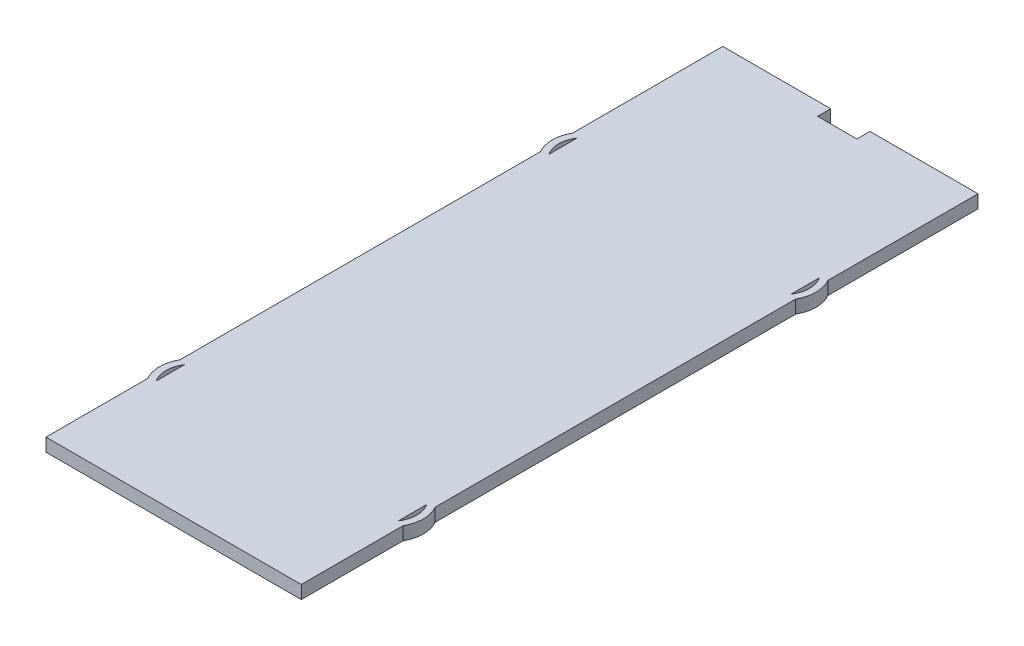
ISO-10303-21;
HEADER;
FILE_DESCRIPTION(('STEP AP214'),'2;1');
FILE_NAME('part.step','',(''),(''),'','','');
FILE_SCHEMA(('AUTOMOTIVE_DESIGN { 1 0 10303 214 1 1 1 1 }'));
ENDSEC;
DATA;
#1=APPLICATION_CONTEXT('core data for automotive mechanical design processes');
#2=APPLICATION_PROTOCOL_DEFINITION('international standard','automotive_design',2000,#1);
#3=PRODUCT_CONTEXT('',#1,'mechanical');
#4=PRODUCT('Part','Part','',(#3));
#5=PRODUCT_RELATED_PRODUCT_CATEGORY('part','',(#4));
#6=PRODUCT_DEFINITION_FORMATION('','',#4);
#7=PRODUCT_DEFINITION_CONTEXT('part definition',#1,'design');
#8=PRODUCT_DEFINITION('design','',#6,#7);
#9=PRODUCT_DEFINITION_SHAPE('','',#8);
#10=(LENGTH_UNIT() NAMED_UNIT(*) SI_UNIT(.MILLI.,.METRE.));
#11=(NAMED_UNIT(*) PLANE_ANGLE_UNIT() SI_UNIT($,.RADIAN.));
#12=(NAMED_UNIT(*) SI_UNIT($,.STERADIAN.) SOLID_ANGLE_UNIT());
#13=UNCERTAINTY_MEASURE_WITH_UNIT(LENGTH_MEASURE(1.E-05),#10,'distance_accuracy_value','');
#14=(GEOMETRIC_REPRESENTATION_CONTEXT(3) GLOBAL_UNCERTAINTY_ASSIGNED_CONTEXT((#13)) GLOBAL_UNIT_ASSIGNED_CONTEXT((#10,
#11,#12)) REPRESENTATION_CONTEXT('',''));
#15=CARTESIAN_POINT('',(0.,0.,0.));
#16=DIRECTION('',(0.,0.,1.));
#17=DIRECTION('',(1.,0.,0.));
#18=AXIS2_PLACEMENT_3D('',#15,#16,#17);
#19=CARTESIAN_POINT('',(-19.5,-110.51045199437,-85.4));
#20=DIRECTION('',(0.,0.,-1.));
#21=DIRECTION('',(-1.,0.,0.));
#22=AXIS2_PLACEMENT_3D('',#19,#20,#21);
#23=PLANE('',#22);
#24=DIRECTION('',(0.,1.,0.));
#25=VECTOR('',#24,1.);
#26=CARTESIAN_POINT('',(-3.,0.,-85.4));
#27=LINE('',#26,#25);
#28=CARTESIAN_POINT('',(-3.,0.,-85.4));
#29=VERTEX_POINT('',#28);
#30=CARTESIAN_POINT('',(-3.,2.,-85.4));
#31=VERTEX_POINT('',#30);
#32=EDGE_CURVE('E278',#29,#31,#27,.T.);
#33=ORIENTED_EDGE('',*,*,#32,.F.);
#34=DIRECTION('',(1.,0.,0.));
#35=VECTOR('',#34,1.);
#36=CARTESIAN_POINT('',(-19.5,0.,-85.4));
#37=LINE('',#36,#35);
#38=CARTESIAN_POINT('',(-19.5,0.,-85.4));
#39=VERTEX_POINT('',#38);
#40=EDGE_CURVE('E314',#39,#29,#37,.T.);
#41=ORIENTED_EDGE('',*,*,#40,.F.);
#42=DIRECTION('',(0.,1.,0.));
#43=VECTOR('',#42,1.);
#44=CARTESIAN_POINT('',(-19.5,-110.51045199437,-85.4));
#45=LINE('',#44,#43);
#46=CARTESIAN_POINT('',(-19.5,2.,-85.4));
#47=VERTEX_POINT('',#46);
#48=EDGE_CURVE('E340',#39,#47,#45,.T.);
#49=ORIENTED_EDGE('',*,*,#48,.T.);
#50=DIRECTION('',(-1.,0.,0.));
#51=VECTOR('',#50,1.);
#52=CARTESIAN_POINT('',(-19.5,2.,-85.4));
#53=LINE('',#52,#51);
#54=EDGE_CURVE('E334',#31,#47,#53,.T.);
#55=ORIENTED_EDGE('',*,*,#54,.F.);
#56=EDGE_LOOP('',(#33,#41,#49,#55));
#57=FACE_BOUND('',#56,.T.);
#58=ADVANCED_FACE('F32',(#57),#23,.T.);
#59=CARTESIAN_POINT('',(-19.5,-110.51045199437,-85.4));
#60=DIRECTION('',(-1.,0.,0.));
#61=DIRECTION('',(0.,0.,1.));
#62=AXIS2_PLACEMENT_3D('',#59,#60,#61);
#63=PLANE('',#62);
#64=DIRECTION('',(0.,0.,-1.));
#65=VECTOR('',#64,1.);
#66=CARTESIAN_POINT('',(-19.5,0.,-85.4));
#67=LINE('',#66,#65);
#68=CARTESIAN_POINT('',(-19.5,0.,-2.45203996704781));
#69=VERTEX_POINT('',#68);
#70=CARTESIAN_POINT('',(-19.5,0.,-57.5479600329522));
#71=VERTEX_POINT('',#70);
#72=EDGE_CURVE('E322',#69,#71,#67,.T.);
#73=ORIENTED_EDGE('',*,*,#72,.F.);
#74=DIRECTION('',(0.,-1.,0.));
#75=VECTOR('',#74,1.);
#76=CARTESIAN_POINT('',(-19.5,2.,-2.45203996704781));
#77=LINE('',#76,#75);
#78=CARTESIAN_POINT('',(-19.5,2.,-2.45203996704781));
#79=VERTEX_POINT('',#78);
#80=EDGE_CURVE('E11',#69,#79,#77,.F.);
#81=ORIENTED_EDGE('',*,*,#80,.T.);
#82=DIRECTION('',(0.,0.,1.));
#83=VECTOR('',#82,1.);
#84=CARTESIAN_POINT('',(-19.5,2.,-85.4));
#85=LINE('',#84,#83);
#86=CARTESIAN_POINT('',(-19.5,2.,-57.5479600329522));
#87=VERTEX_POINT('',#86);
#88=EDGE_CURVE('E327',#87,#79,#85,.T.);
#89=ORIENTED_EDGE('',*,*,#88,.F.);
#90=DIRECTION('',(0.,-1.,0.));
#91=VECTOR('',#90,1.);
#92=CARTESIAN_POINT('',(-19.5,2.,-57.5479600329522));
#93=LINE('',#92,#91);
#94=EDGE_CURVE('E351',#71,#87,#93,.F.);
#95=ORIENTED_EDGE('',*,*,#94,.F.);
#96=EDGE_LOOP('',(#73,#81,#89,#95));
#97=FACE_BOUND('',#96,.T.);
#98=ADVANCED_FACE('F391',(#97),#63,.T.);
#99=CARTESIAN_POINT('',(-19.5,2.,2.45203996704781));
#100=VERTEX_POINT('',#99);
#101=CARTESIAN_POINT('',(-19.5,2.,18.));
#102=VERTEX_POINT('',#101);
#103=EDGE_CURVE('E306',#100,#102,#85,.T.);
#104=ORIENTED_EDGE('',*,*,#103,.F.);
#105=DIRECTION('',(0.,-1.,0.));
#106=VECTOR('',#105,1.);
#107=CARTESIAN_POINT('',(-19.5,2.,2.45203996704781));
#108=LINE('',#107,#106);
#109=CARTESIAN_POINT('',(-19.5,0.,2.45203996704781));
#110=VERTEX_POINT('',#109);
#111=EDGE_CURVE('E40',#100,#110,#108,.T.);
#112=ORIENTED_EDGE('',*,*,#111,.T.);
#113=CARTESIAN_POINT('',(-19.5,0.,18.));
#114=VERTEX_POINT('',#113);
#115=EDGE_CURVE('E318',#114,#110,#67,.T.);
#116=ORIENTED_EDGE('',*,*,#115,.F.);
#117=DIRECTION('',(0.,1.,0.));
#118=VECTOR('',#117,1.);
#119=CARTESIAN_POINT('',(-19.5,-110.51045199437,18.));
#120=LINE('',#119,#118);
#121=EDGE_CURVE('E339',#114,#102,#120,.T.);
#122=ORIENTED_EDGE('',*,*,#121,.T.);
#123=EDGE_LOOP('',(#104,#112,#116,#122));
#124=FACE_BOUND('',#123,.T.);
#125=ADVANCED_FACE('F371',(#124),#63,.T.);
#126=CARTESIAN_POINT('',(19.5,-110.51045199437,-85.4));
#127=DIRECTION('',(1.,0.,0.));
#128=DIRECTION('',(0.,0.,-1.));
#129=AXIS2_PLACEMENT_3D('',#126,#127,#128);
#130=PLANE('',#129);
#131=DIRECTION('',(0.,0.,1.));
#132=VECTOR('',#131,1.);
#133=CARTESIAN_POINT('',(19.5,0.,-85.4));
#134=LINE('',#133,#132);
#135=CARTESIAN_POINT('',(19.5,0.,2.45203996704778));
#136=VERTEX_POINT('',#135);
#137=CARTESIAN_POINT('',(19.5,0.,18.));
#138=VERTEX_POINT('',#137);
#139=EDGE_CURVE('E313',#136,#138,#134,.T.);
#140=ORIENTED_EDGE('',*,*,#139,.F.);
#141=DIRECTION('',(0.,-1.,0.));
#142=VECTOR('',#141,1.);
#143=CARTESIAN_POINT('',(19.5,2.,2.45203996704779));
#144=LINE('',#143,#142);
#145=CARTESIAN_POINT('',(19.5,2.,2.45203996704778));
#146=VERTEX_POINT('',#145);
#147=EDGE_CURVE('E299',#136,#146,#144,.F.);
#148=ORIENTED_EDGE('',*,*,#147,.T.);
#149=DIRECTION('',(0.,0.,-1.));
#150=VECTOR('',#149,1.);
#151=CARTESIAN_POINT('',(19.5,2.,-85.4));
#152=LINE('',#151,#150);
#153=CARTESIAN_POINT('',(19.5,2.,18.));
#154=VERTEX_POINT('',#153);
#155=EDGE_CURVE('E331',#154,#146,#152,.T.);
#156=ORIENTED_EDGE('',*,*,#155,.F.);
#157=DIRECTION('',(0.,1.,0.));
#158=VECTOR('',#157,1.);
#159=CARTESIAN_POINT('',(19.5,-110.51045199437,18.));
#160=LINE('',#159,#158);
#161=EDGE_CURVE('E346',#138,#154,#160,.T.);
#162=ORIENTED_EDGE('',*,*,#161,.F.);
#163=EDGE_LOOP('',(#140,#148,#156,#162));
#164=FACE_BOUND('',#163,.T.);
#165=ADVANCED_FACE('F458',(#164),#130,.T.);
#166=CARTESIAN_POINT('',(19.5,2.,-2.4520399670478));
#167=VERTEX_POINT('',#166);
#168=CARTESIAN_POINT('',(19.5,2.,-57.5479600329522));
#169=VERTEX_POINT('',#168);
#170=EDGE_CURVE('E335',#167,#169,#152,.T.);
#171=ORIENTED_EDGE('',*,*,#170,.F.);
#172=DIRECTION('',(0.,-1.,0.));
#173=VECTOR('',#172,1.);
#174=CARTESIAN_POINT('',(19.5,2.,-2.4520399670478));
#175=LINE('',#174,#173);
#176=CARTESIAN_POINT('',(19.5,0.,-2.4520399670478));
#177=VERTEX_POINT('',#176);
#178=EDGE_CURVE('E295',#167,#177,#175,.T.);
#179=ORIENTED_EDGE('',*,*,#178,.T.);
#180=CARTESIAN_POINT('',(19.5,0.,-57.5479600329522));
#181=VERTEX_POINT('',#180);
#182=EDGE_CURVE('E312',#181,#177,#134,.T.);
#183=ORIENTED_EDGE('',*,*,#182,.F.);
#184=DIRECTION('',(0.,-1.,0.));
#185=VECTOR('',#184,1.);
#186=CARTESIAN_POINT('',(19.5,2.,-57.5479600329522));
#187=LINE('',#186,#185);
#188=EDGE_CURVE('E365',#181,#169,#187,.F.);
#189=ORIENTED_EDGE('',*,*,#188,.T.);
#190=EDGE_LOOP('',(#171,#179,#183,#189));
#191=FACE_BOUND('',#190,.T.);
#192=ADVANCED_FACE('F457',(#191),#130,.T.);
#193=CARTESIAN_POINT('',(19.5,2.,-62.4520399670478));
#194=VERTEX_POINT('',#193);
#195=CARTESIAN_POINT('',(19.5,2.,-85.4));
#196=VERTEX_POINT('',#195);
#197=EDGE_CURVE('E330',#194,#196,#152,.T.);
#198=ORIENTED_EDGE('',*,*,#197,.F.);
#199=DIRECTION('',(0.,-1.,0.));
#200=VECTOR('',#199,1.);
#201=CARTESIAN_POINT('',(19.5,2.,-62.4520399670478));
#202=LINE('',#201,#200);
#203=CARTESIAN_POINT('',(19.5,0.,-62.4520399670478));
#204=VERTEX_POINT('',#203);
#205=EDGE_CURVE('E360',#194,#204,#202,.T.);
#206=ORIENTED_EDGE('',*,*,#205,.T.);
#207=CARTESIAN_POINT('',(19.5,0.,-85.4));
#208=VERTEX_POINT('',#207);
#209=EDGE_CURVE('E308',#208,#204,#134,.T.);
#210=ORIENTED_EDGE('',*,*,#209,.F.);
#211=DIRECTION('',(0.,1.,0.));
#212=VECTOR('',#211,1.);
#213=CARTESIAN_POINT('',(19.5,-110.51045199437,-85.4));
#214=LINE('',#213,#212);
#215=EDGE_CURVE('E343',#208,#196,#214,.T.);
#216=ORIENTED_EDGE('',*,*,#215,.T.);
#217=EDGE_LOOP('',(#198,#206,#210,#216));
#218=FACE_BOUND('',#217,.T.);
#219=ADVANCED_FACE('F438',(#218),#130,.T.);
#220=CARTESIAN_POINT('',(-15.2,2.,-60.));
#221=DIRECTION('',(0.,-1.,0.));
#222=DIRECTION('',(0.,0.,-1.));
#223=AXIS2_PLACEMENT_3D('',#220,#221,#222);
#224=CYLINDRICAL_SURFACE('',#223,4.95);
#225=CARTESIAN_POINT('',(-15.2,2.,-60.));
#226=DIRECTION('',(0.,1.,0.));
#227=DIRECTION('',(0.,0.,1.));
#228=AXIS2_PLACEMENT_3D('',#225,#226,#227);
#229=CIRCLE('',#228,4.95);
#230=CARTESIAN_POINT('',(-19.5,2.,-62.4520399670478));
#231=VERTEX_POINT('',#230);
#232=EDGE_CURVE('E357',#231,#87,#229,.T.);
#233=ORIENTED_EDGE('',*,*,#232,.F.);
#234=DIRECTION('',(0.,-1.,0.));
#235=VECTOR('',#234,1.);
#236=CARTESIAN_POINT('',(-19.5,2.,-62.4520399670478));
#237=LINE('',#236,#235);
#238=CARTESIAN_POINT('',(-19.5,0.,-62.4520399670478));
#239=VERTEX_POINT('',#238);
#240=EDGE_CURVE('E353',#231,#239,#237,.T.);
#241=ORIENTED_EDGE('',*,*,#240,.T.);
#242=CARTESIAN_POINT('',(-15.2,0.,-60.));
#243=DIRECTION('',(0.,1.,0.));
#244=DIRECTION('',(0.,0.,1.));
#245=AXIS2_PLACEMENT_3D('',#242,#243,#244);
#246=CIRCLE('',#245,4.95);
#247=EDGE_CURVE('E356',#239,#71,#246,.T.);
#248=ORIENTED_EDGE('',*,*,#247,.T.);
#249=ORIENTED_EDGE('',*,*,#94,.T.);
#250=EDGE_LOOP('',(#233,#241,#248,#249));
#251=FACE_BOUND('',#250,.T.);
#252=ADVANCED_FACE('F34',(#251),#224,.T.);
#253=CARTESIAN_POINT('',(-15.2,2.,-60.));
#254=DIRECTION('',(0.,1.,0.));
#255=DIRECTION('',(0.,0.,1.));
#256=AXIS2_PLACEMENT_3D('',#253,#254,#255);
#257=PLANE('',#256);
#258=CARTESIAN_POINT('',(15.2,2.,0.));
#259=DIRECTION('',(0.,-1.,0.));
#260=DIRECTION('',(0.,0.,-1.));
#261=AXIS2_PLACEMENT_3D('',#258,#259,#260);
#262=CIRCLE('',#261,3.95);
#263=CARTESIAN_POINT('',(18.5,2.,-2.1708293346092));
#264=VERTEX_POINT('',#263);
#265=CARTESIAN_POINT('',(18.5,2.,2.17082933460919));
#266=VERTEX_POINT('',#265);
#267=EDGE_CURVE('E47',#264,#266,#262,.T.);
#268=ORIENTED_EDGE('',*,*,#267,.T.);
#269=DIRECTION('',(0.,0.,-1.));
#270=VECTOR('',#269,1.);
#271=CARTESIAN_POINT('',(18.5,2.,-2.1708293346092));
#272=LINE('',#271,#270);
#273=EDGE_CURVE('E200',#266,#264,#272,.T.);
#274=ORIENTED_EDGE('',*,*,#273,.T.);
#275=EDGE_LOOP('',(#268,#274));
#276=FACE_BOUND('',#275,.T.);
#277=CARTESIAN_POINT('',(-15.2,2.,0.));
#278=DIRECTION('',(0.,-1.,0.));
#279=DIRECTION('',(0.,0.,-1.));
#280=AXIS2_PLACEMENT_3D('',#277,#278,#279);
#281=CIRCLE('',#280,3.95);
#282=CARTESIAN_POINT('',(-18.5,2.,2.17082933460921));
#283=VERTEX_POINT('',#282);
#284=CARTESIAN_POINT('',(-18.5,2.,-2.17082933460921));
#285=VERTEX_POINT('',#284);
#286=EDGE_CURVE('E55',#283,#285,#281,.T.);
#287=ORIENTED_EDGE('',*,*,#286,.T.);
#288=DIRECTION('',(0.,0.,1.));
#289=VECTOR('',#288,1.);
#290=CARTESIAN_POINT('',(-18.5,2.,-2.17082933460921));
#291=LINE('',#290,#289);
#292=EDGE_CURVE('E217',#285,#283,#291,.T.);
#293=ORIENTED_EDGE('',*,*,#292,.T.);
#294=EDGE_LOOP('',(#287,#293));
#295=FACE_BOUND('',#294,.T.);
#296=CARTESIAN_POINT('',(-15.2,2.,-60.));
#297=DIRECTION('',(0.,-1.,0.));
#298=DIRECTION('',(0.,0.,-1.));
#299=AXIS2_PLACEMENT_3D('',#296,#297,#298);
#300=CIRCLE('',#299,3.95);
#301=CARTESIAN_POINT('',(-18.5,2.,-57.8291706653908));
#302=VERTEX_POINT('',#301);
#303=CARTESIAN_POINT('',(-18.5,2.,-62.1708293346092));
#304=VERTEX_POINT('',#303);
#305=EDGE_CURVE('E230',#302,#304,#300,.T.);
#306=ORIENTED_EDGE('',*,*,#305,.T.);
#307=DIRECTION('',(0.,0.,1.));
#308=VECTOR('',#307,1.);
#309=CARTESIAN_POINT('',(-18.5,2.,-62.1708293346092));
#310=LINE('',#309,#308);
#311=EDGE_CURVE('E233',#304,#302,#310,.T.);
#312=ORIENTED_EDGE('',*,*,#311,.T.);
#313=EDGE_LOOP('',(#306,#312));
#314=FACE_BOUND('',#313,.T.);
#315=CARTESIAN_POINT('',(15.2,2.,-60.));
#316=DIRECTION('',(0.,-1.,0.));
#317=DIRECTION('',(0.,0.,-1.));
#318=AXIS2_PLACEMENT_3D('',#315,#316,#317);
#319=CIRCLE('',#318,3.95);
#320=CARTESIAN_POINT('',(18.5,2.,-62.1708293346092));
#321=VERTEX_POINT('',#320);
#322=CARTESIAN_POINT('',(18.5,2.,-57.8291706653908));
#323=VERTEX_POINT('',#322);
#324=EDGE_CURVE('E245',#321,#323,#319,.T.);
#325=ORIENTED_EDGE('',*,*,#324,.T.);
#326=DIRECTION('',(0.,0.,-1.));
#327=VECTOR('',#326,1.);
#328=CARTESIAN_POINT('',(18.5,2.,-62.1708293346092));
#329=LINE('',#328,#327);
#330=EDGE_CURVE('E248',#323,#321,#329,.T.);
#331=ORIENTED_EDGE('',*,*,#330,.T.);
#332=EDGE_LOOP('',(#325,#331));
#333=FACE_BOUND('',#332,.T.);
#334=DIRECTION('',(0.,0.,1.));
#335=VECTOR('',#334,1.);
#336=CARTESIAN_POINT('',(-3.,2.,-85.4));
#337=LINE('',#336,#335);
#338=CARTESIAN_POINT('',(-3.,2.,-83.4));
#339=VERTEX_POINT('',#338);
#340=EDGE_CURVE('E258',#31,#339,#337,.T.);
#341=ORIENTED_EDGE('',*,*,#340,.F.);
#342=ORIENTED_EDGE('',*,*,#54,.T.);
#343=EDGE_CURVE('E323',#47,#231,#85,.T.);
#344=ORIENTED_EDGE('',*,*,#343,.T.);
#345=ORIENTED_EDGE('',*,*,#232,.T.);
#346=ORIENTED_EDGE('',*,*,#88,.T.);
#347=CARTESIAN_POINT('',(-15.2,2.,0.));
#348=DIRECTION('',(0.,1.,0.));
#349=DIRECTION('',(0.,0.,1.));
#350=AXIS2_PLACEMENT_3D('',#347,#348,#349);
#351=CIRCLE('',#350,4.95);
#352=EDGE_CURVE('E287',#79,#100,#351,.T.);
#353=ORIENTED_EDGE('',*,*,#352,.T.);
#354=ORIENTED_EDGE('',*,*,#103,.T.);
#355=DIRECTION('',(1.,0.,0.));
#356=VECTOR('',#355,1.);
#357=CARTESIAN_POINT('',(-19.5,2.,18.));
#358=LINE('',#357,#356);
#359=EDGE_CURVE('E326',#102,#154,#358,.T.);
#360=ORIENTED_EDGE('',*,*,#359,.T.);
#361=ORIENTED_EDGE('',*,*,#155,.T.);
#362=CARTESIAN_POINT('',(15.2,2.,0.));
#363=DIRECTION('',(0.,1.,0.));
#364=DIRECTION('',(0.,0.,1.));
#365=AXIS2_PLACEMENT_3D('',#362,#363,#364);
#366=CIRCLE('',#365,4.95);
#367=EDGE_CURVE('E292',#146,#167,#366,.T.);
#368=ORIENTED_EDGE('',*,*,#367,.T.);
#369=ORIENTED_EDGE('',*,*,#170,.T.);
#370=CARTESIAN_POINT('',(15.2,2.,-60.));
#371=DIRECTION('',(0.,1.,0.));
#372=DIRECTION('',(0.,0.,1.));
#373=AXIS2_PLACEMENT_3D('',#370,#371,#372);
#374=CIRCLE('',#373,4.95);
#375=EDGE_CURVE('E303',#169,#194,#374,.T.);
#376=ORIENTED_EDGE('',*,*,#375,.T.);
#377=ORIENTED_EDGE('',*,*,#197,.T.);
#378=CARTESIAN_POINT('',(3.,2.,-85.4));
#379=VERTEX_POINT('',#378);
#380=EDGE_CURVE('E336',#196,#379,#53,.T.);
#381=ORIENTED_EDGE('',*,*,#380,.T.);
#382=DIRECTION('',(0.,0.,-1.));
#383=VECTOR('',#382,1.);
#384=CARTESIAN_POINT('',(3.,2.,-85.4));
#385=LINE('',#384,#383);
#386=CARTESIAN_POINT('',(3.,2.,-83.4));
#387=VERTEX_POINT('',#386);
#388=EDGE_CURVE('E265',#387,#379,#385,.T.);
#389=ORIENTED_EDGE('',*,*,#388,.F.);
#390=DIRECTION('',(1.,0.,0.));
#391=VECTOR('',#390,1.);
#392=CARTESIAN_POINT('',(-3.,2.,-83.4));
#393=LINE('',#392,#391);
#394=EDGE_CURVE('E274',#339,#387,#393,.T.);
#395=ORIENTED_EDGE('',*,*,#394,.F.);
#396=EDGE_LOOP('',(#341,#342,#344,#345,#346,#353,#354,#360,#361,#368,#369,#376,#377,#381,#389,#395));
#397=FACE_BOUND('',#396,.T.);
#398=ADVANCED_FACE('F206',(#276,#295,#314,#333,#397),#257,.T.);
#399=CARTESIAN_POINT('',(-15.2,0.,-60.));
#400=DIRECTION('',(0.,1.,0.));
#401=DIRECTION('',(0.,0.,1.));
#402=AXIS2_PLACEMENT_3D('',#399,#400,#401);
#403=PLANE('',#402);
#404=DIRECTION('',(0.,0.,-1.));
#405=VECTOR('',#404,1.);
#406=CARTESIAN_POINT('',(18.5,0.,-2.1708293346092));
#407=LINE('',#406,#405);
#408=CARTESIAN_POINT('',(18.5,0.,2.17082933460919));
#409=VERTEX_POINT('',#408);
#410=CARTESIAN_POINT('',(18.5,0.,-2.1708293346092));
#411=VERTEX_POINT('',#410);
#412=EDGE_CURVE('E208',#409,#411,#407,.T.);
#413=ORIENTED_EDGE('',*,*,#412,.F.);
#414=CARTESIAN_POINT('',(15.2,0.,0.));
#415=DIRECTION('',(0.,-1.,0.));
#416=DIRECTION('',(0.,0.,-1.));
#417=AXIS2_PLACEMENT_3D('',#414,#415,#416);
#418=CIRCLE('',#417,3.95);
#419=EDGE_CURVE('E195',#411,#409,#418,.T.);
#420=ORIENTED_EDGE('',*,*,#419,.F.);
#421=EDGE_LOOP('',(#413,#420));
#422=FACE_BOUND('',#421,.T.);
#423=DIRECTION('',(0.,0.,1.));
#424=VECTOR('',#423,1.);
#425=CARTESIAN_POINT('',(-18.5,0.,-2.17082933460921));
#426=LINE('',#425,#424);
#427=CARTESIAN_POINT('',(-18.5,0.,-2.17082933460921));
#428=VERTEX_POINT('',#427);
#429=CARTESIAN_POINT('',(-18.5,0.,2.17082933460921));
#430=VERTEX_POINT('',#429);
#431=EDGE_CURVE('E218',#428,#430,#426,.T.);
#432=ORIENTED_EDGE('',*,*,#431,.F.);
#433=CARTESIAN_POINT('',(-15.2,0.,0.));
#434=DIRECTION('',(0.,-1.,0.));
#435=DIRECTION('',(0.,0.,-1.));
#436=AXIS2_PLACEMENT_3D('',#433,#434,#435);
#437=CIRCLE('',#436,3.95);
#438=EDGE_CURVE('E222',#430,#428,#437,.T.);
#439=ORIENTED_EDGE('',*,*,#438,.F.);
#440=EDGE_LOOP('',(#432,#439));
#441=FACE_BOUND('',#440,.T.);
#442=DIRECTION('',(0.,0.,1.));
#443=VECTOR('',#442,1.);
#444=CARTESIAN_POINT('',(-18.5,0.,-62.1708293346092));
#445=LINE('',#444,#443);
#446=CARTESIAN_POINT('',(-18.5,0.,-62.1708293346092));
#447=VERTEX_POINT('',#446);
#448=CARTESIAN_POINT('',(-18.5,0.,-57.8291706653908));
#449=VERTEX_POINT('',#448);
#450=EDGE_CURVE('E234',#447,#449,#445,.T.);
#451=ORIENTED_EDGE('',*,*,#450,.F.);
#452=CARTESIAN_POINT('',(-15.2,0.,-60.));
#453=DIRECTION('',(0.,-1.,0.));
#454=DIRECTION('',(0.,0.,-1.));
#455=AXIS2_PLACEMENT_3D('',#452,#453,#454);
#456=CIRCLE('',#455,3.95);
#457=EDGE_CURVE('E238',#449,#447,#456,.T.);
#458=ORIENTED_EDGE('',*,*,#457,.F.);
#459=EDGE_LOOP('',(#451,#458));
#460=FACE_BOUND('',#459,.T.);
#461=DIRECTION('',(0.,0.,-1.));
#462=VECTOR('',#461,1.);
#463=CARTESIAN_POINT('',(18.5,0.,-62.1708293346092));
#464=LINE('',#463,#462);
#465=CARTESIAN_POINT('',(18.5,0.,-57.8291706653908));
#466=VERTEX_POINT('',#465);
#467=CARTESIAN_POINT('',(18.5,0.,-62.1708293346092));
#468=VERTEX_POINT('',#467);
#469=EDGE_CURVE('E249',#466,#468,#464,.T.);
#470=ORIENTED_EDGE('',*,*,#469,.F.);
#471=CARTESIAN_POINT('',(15.2,0.,-60.));
#472=DIRECTION('',(0.,-1.,0.));
#473=DIRECTION('',(0.,0.,-1.));
#474=AXIS2_PLACEMENT_3D('',#471,#472,#473);
#475=CIRCLE('',#474,3.95);
#476=EDGE_CURVE('E214',#468,#466,#475,.T.);
#477=ORIENTED_EDGE('',*,*,#476,.F.);
#478=EDGE_LOOP('',(#470,#477));
#479=FACE_BOUND('',#478,.T.);
#480=ORIENTED_EDGE('',*,*,#40,.T.);
#481=DIRECTION('',(0.,0.,1.));
#482=VECTOR('',#481,1.);
#483=CARTESIAN_POINT('',(-3.,0.,-85.4));
#484=LINE('',#483,#482);
#485=CARTESIAN_POINT('',(-3.,0.,-83.4));
#486=VERTEX_POINT('',#485);
#487=EDGE_CURVE('E261',#29,#486,#484,.T.);
#488=ORIENTED_EDGE('',*,*,#487,.T.);
#489=DIRECTION('',(1.,0.,0.));
#490=VECTOR('',#489,1.);
#491=CARTESIAN_POINT('',(-3.,0.,-83.4));
#492=LINE('',#491,#490);
#493=CARTESIAN_POINT('',(3.,0.,-83.4));
#494=VERTEX_POINT('',#493);
#495=EDGE_CURVE('E264',#486,#494,#492,.T.);
#496=ORIENTED_EDGE('',*,*,#495,.T.);
#497=DIRECTION('',(0.,0.,-1.));
#498=VECTOR('',#497,1.);
#499=CARTESIAN_POINT('',(3.,0.,-85.4));
#500=LINE('',#499,#498);
#501=CARTESIAN_POINT('',(3.,0.,-85.4));
#502=VERTEX_POINT('',#501);
#503=EDGE_CURVE('E268',#494,#502,#500,.T.);
#504=ORIENTED_EDGE('',*,*,#503,.T.);
#505=EDGE_CURVE('E311',#502,#208,#37,.T.);
#506=ORIENTED_EDGE('',*,*,#505,.T.);
#507=ORIENTED_EDGE('',*,*,#209,.T.);
#508=CARTESIAN_POINT('',(15.2,0.,-60.));
#509=DIRECTION('',(0.,1.,0.));
#510=DIRECTION('',(0.,0.,1.));
#511=AXIS2_PLACEMENT_3D('',#508,#509,#510);
#512=CIRCLE('',#511,4.95);
#513=EDGE_CURVE('E302',#181,#204,#512,.T.);
#514=ORIENTED_EDGE('',*,*,#513,.F.);
#515=ORIENTED_EDGE('',*,*,#182,.T.);
#516=CARTESIAN_POINT('',(15.2,0.,0.));
#517=DIRECTION('',(0.,1.,0.));
#518=DIRECTION('',(0.,0.,1.));
#519=AXIS2_PLACEMENT_3D('',#516,#517,#518);
#520=CIRCLE('',#519,4.95);
#521=EDGE_CURVE('E290',#136,#177,#520,.T.);
#522=ORIENTED_EDGE('',*,*,#521,.F.);
#523=ORIENTED_EDGE('',*,*,#139,.T.);
#524=DIRECTION('',(-1.,0.,0.));
#525=VECTOR('',#524,1.);
#526=CARTESIAN_POINT('',(-19.5,0.,18.));
#527=LINE('',#526,#525);
#528=EDGE_CURVE('E321',#138,#114,#527,.T.);
#529=ORIENTED_EDGE('',*,*,#528,.T.);
#530=ORIENTED_EDGE('',*,*,#115,.T.);
#531=CARTESIAN_POINT('',(-15.2,0.,0.));
#532=DIRECTION('',(0.,1.,0.));
#533=DIRECTION('',(0.,0.,1.));
#534=AXIS2_PLACEMENT_3D('',#531,#532,#533);
#535=CIRCLE('',#534,4.95);
#536=EDGE_CURVE('E280',#69,#110,#535,.T.);
#537=ORIENTED_EDGE('',*,*,#536,.F.);
#538=ORIENTED_EDGE('',*,*,#72,.T.);
#539=ORIENTED_EDGE('',*,*,#247,.F.);
#540=EDGE_CURVE('E317',#239,#39,#67,.T.);
#541=ORIENTED_EDGE('',*,*,#540,.T.);
#542=EDGE_LOOP('',(#480,#488,#496,#504,#506,#507,#514,#515,#522,#523,#529,#530,#537,#538,#539,#541));
#543=FACE_BOUND('',#542,.T.);
#544=ADVANCED_FACE('F375',(#422,#441,#460,#479,#543),#403,.F.);
#545=ORIENTED_EDGE('',*,*,#240,.F.);
#546=ORIENTED_EDGE('',*,*,#343,.F.);
#547=ORIENTED_EDGE('',*,*,#48,.F.);
#548=ORIENTED_EDGE('',*,*,#540,.F.);
#549=EDGE_LOOP('',(#545,#546,#547,#548));
#550=FACE_BOUND('',#549,.T.);
#551=ADVANCED_FACE('F415',(#550),#63,.T.);
#552=DIRECTION('',(0.,1.,0.));
#553=VECTOR('',#552,1.);
#554=CARTESIAN_POINT('',(3.,0.,-85.4));
#555=LINE('',#554,#553);
#556=EDGE_CURVE('E281',#502,#379,#555,.T.);
#557=ORIENTED_EDGE('',*,*,#556,.T.);
#558=ORIENTED_EDGE('',*,*,#380,.F.);
#559=ORIENTED_EDGE('',*,*,#215,.F.);
#560=ORIENTED_EDGE('',*,*,#505,.F.);
#561=EDGE_LOOP('',(#557,#558,#559,#560));
#562=FACE_BOUND('',#561,.T.);
#563=ADVANCED_FACE('F410',(#562),#23,.T.);
#564=CARTESIAN_POINT('',(-19.5,-110.51045199437,18.));
#565=DIRECTION('',(0.,0.,1.));
#566=DIRECTION('',(1.,0.,0.));
#567=AXIS2_PLACEMENT_3D('',#564,#565,#566);
#568=PLANE('',#567);
#569=ORIENTED_EDGE('',*,*,#528,.F.);
#570=ORIENTED_EDGE('',*,*,#161,.T.);
#571=ORIENTED_EDGE('',*,*,#359,.F.);
#572=ORIENTED_EDGE('',*,*,#121,.F.);
#573=EDGE_LOOP('',(#569,#570,#571,#572));
#574=FACE_BOUND('',#573,.T.);
#575=ADVANCED_FACE('F381',(#574),#568,.T.);
#576=CARTESIAN_POINT('',(15.2,2.,-60.));
#577=DIRECTION('',(0.,-1.,0.));
#578=DIRECTION('',(0.,0.,-1.));
#579=AXIS2_PLACEMENT_3D('',#576,#577,#578);
#580=CYLINDRICAL_SURFACE('',#579,4.95);
#581=ORIENTED_EDGE('',*,*,#188,.F.);
#582=ORIENTED_EDGE('',*,*,#513,.T.);
#583=ORIENTED_EDGE('',*,*,#205,.F.);
#584=ORIENTED_EDGE('',*,*,#375,.F.);
#585=EDGE_LOOP('',(#581,#582,#583,#584));
#586=FACE_BOUND('',#585,.T.);
#587=ADVANCED_FACE('F404',(#586),#580,.T.);
#588=CARTESIAN_POINT('',(15.2,2.,0.));
#589=DIRECTION('',(0.,-1.,0.));
#590=DIRECTION('',(0.,0.,-1.));
#591=AXIS2_PLACEMENT_3D('',#588,#589,#590);
#592=CYLINDRICAL_SURFACE('',#591,4.95);
#593=ORIENTED_EDGE('',*,*,#147,.F.);
#594=ORIENTED_EDGE('',*,*,#521,.T.);
#595=ORIENTED_EDGE('',*,*,#178,.F.);
#596=ORIENTED_EDGE('',*,*,#367,.F.);
#597=EDGE_LOOP('',(#593,#594,#595,#596));
#598=FACE_BOUND('',#597,.T.);
#599=ADVANCED_FACE('F395',(#598),#592,.T.);
#600=CARTESIAN_POINT('',(-15.2,2.,0.));
#601=DIRECTION('',(0.,-1.,0.));
#602=DIRECTION('',(0.,0.,-1.));
#603=AXIS2_PLACEMENT_3D('',#600,#601,#602);
#604=CYLINDRICAL_SURFACE('',#603,4.95);
#605=ORIENTED_EDGE('',*,*,#80,.F.);
#606=ORIENTED_EDGE('',*,*,#536,.T.);
#607=ORIENTED_EDGE('',*,*,#111,.F.);
#608=ORIENTED_EDGE('',*,*,#352,.F.);
#609=EDGE_LOOP('',(#605,#606,#607,#608));
#610=FACE_BOUND('',#609,.T.);
#611=ADVANCED_FACE('F392',(#610),#604,.T.);
#612=CARTESIAN_POINT('',(-3.,0.,-85.4));
#613=DIRECTION('',(-1.,0.,0.));
#614=DIRECTION('',(0.,0.,1.));
#615=AXIS2_PLACEMENT_3D('',#612,#613,#614);
#616=PLANE('',#615);
#617=ORIENTED_EDGE('',*,*,#340,.T.);
#618=DIRECTION('',(0.,1.,0.));
#619=VECTOR('',#618,1.);
#620=CARTESIAN_POINT('',(-3.,0.,-83.4));
#621=LINE('',#620,#619);
#622=EDGE_CURVE('E271',#486,#339,#621,.T.);
#623=ORIENTED_EDGE('',*,*,#622,.F.);
#624=ORIENTED_EDGE('',*,*,#487,.F.);
#625=ORIENTED_EDGE('',*,*,#32,.T.);
#626=EDGE_LOOP('',(#617,#623,#624,#625));
#627=FACE_BOUND('',#626,.T.);
#628=ADVANCED_FACE('F394',(#627),#616,.F.);
#629=CARTESIAN_POINT('',(3.,0.,-85.4));
#630=DIRECTION('',(1.,0.,0.));
#631=DIRECTION('',(0.,0.,-1.));
#632=AXIS2_PLACEMENT_3D('',#629,#630,#631);
#633=PLANE('',#632);
#634=ORIENTED_EDGE('',*,*,#388,.T.);
#635=ORIENTED_EDGE('',*,*,#556,.F.);
#636=ORIENTED_EDGE('',*,*,#503,.F.);
#637=DIRECTION('',(0.,1.,0.));
#638=VECTOR('',#637,1.);
#639=CARTESIAN_POINT('',(3.,0.,-83.4));
#640=LINE('',#639,#638);
#641=EDGE_CURVE('E284',#494,#387,#640,.T.);
#642=ORIENTED_EDGE('',*,*,#641,.T.);
#643=EDGE_LOOP('',(#634,#635,#636,#642));
#644=FACE_BOUND('',#643,.T.);
#645=ADVANCED_FACE('F401',(#644),#633,.F.);
#646=CARTESIAN_POINT('',(-3.,0.,-83.4));
#647=DIRECTION('',(0.,0.,1.));
#648=DIRECTION('',(1.,0.,0.));
#649=AXIS2_PLACEMENT_3D('',#646,#647,#648);
#650=PLANE('',#649);
#651=ORIENTED_EDGE('',*,*,#394,.T.);
#652=ORIENTED_EDGE('',*,*,#641,.F.);
#653=ORIENTED_EDGE('',*,*,#495,.F.);
#654=ORIENTED_EDGE('',*,*,#622,.T.);
#655=EDGE_LOOP('',(#651,#652,#653,#654));
#656=FACE_BOUND('',#655,.T.);
#657=ADVANCED_FACE('F443',(#656),#650,.F.);
#658=CARTESIAN_POINT('',(15.2,2.,-60.));
#659=DIRECTION('',(0.,-1.,0.));
#660=DIRECTION('',(0.,0.,-1.));
#661=AXIS2_PLACEMENT_3D('',#658,#659,#660);
#662=CYLINDRICAL_SURFACE('',#661,3.95);
#663=ORIENTED_EDGE('',*,*,#476,.T.);
#664=DIRECTION('',(0.,-1.,0.));
#665=VECTOR('',#664,1.);
#666=CARTESIAN_POINT('',(18.5,2.,-57.8291706653908));
#667=LINE('',#666,#665);
#668=EDGE_CURVE('E252',#323,#466,#667,.T.);
#669=ORIENTED_EDGE('',*,*,#668,.F.);
#670=ORIENTED_EDGE('',*,*,#324,.F.);
#671=DIRECTION('',(0.,-1.,0.));
#672=VECTOR('',#671,1.);
#673=CARTESIAN_POINT('',(18.5,2.,-62.1708293346092));
#674=LINE('',#673,#672);
#675=EDGE_CURVE('E256',#321,#468,#674,.T.);
#676=ORIENTED_EDGE('',*,*,#675,.T.);
#677=EDGE_LOOP('',(#663,#669,#670,#676));
#678=FACE_BOUND('',#677,.T.);
#679=ADVANCED_FACE('F522',(#678),#662,.F.);
#680=CARTESIAN_POINT('',(18.5,2.,-62.1708293346092));
#681=DIRECTION('',(-1.,0.,0.));
#682=DIRECTION('',(0.,0.,1.));
#683=AXIS2_PLACEMENT_3D('',#680,#681,#682);
#684=PLANE('',#683);
#685=ORIENTED_EDGE('',*,*,#469,.T.);
#686=ORIENTED_EDGE('',*,*,#675,.F.);
#687=ORIENTED_EDGE('',*,*,#330,.F.);
#688=ORIENTED_EDGE('',*,*,#668,.T.);
#689=EDGE_LOOP('',(#685,#686,#687,#688));
#690=FACE_BOUND('',#689,.T.);
#691=ADVANCED_FACE('F547',(#690),#684,.F.);
#692=CARTESIAN_POINT('',(-15.2,2.,-60.));
#693=DIRECTION('',(0.,-1.,0.));
#694=DIRECTION('',(0.,0.,-1.));
#695=AXIS2_PLACEMENT_3D('',#692,#693,#694);
#696=CYLINDRICAL_SURFACE('',#695,3.95);
#697=ORIENTED_EDGE('',*,*,#457,.T.);
#698=DIRECTION('',(0.,-1.,0.));
#699=VECTOR('',#698,1.);
#700=CARTESIAN_POINT('',(-18.5,2.,-62.1708293346092));
#701=LINE('',#700,#699);
#702=EDGE_CURVE('E237',#304,#447,#701,.T.);
#703=ORIENTED_EDGE('',*,*,#702,.F.);
#704=ORIENTED_EDGE('',*,*,#305,.F.);
#705=DIRECTION('',(0.,-1.,0.));
#706=VECTOR('',#705,1.);
#707=CARTESIAN_POINT('',(-18.5,2.,-57.8291706653908));
#708=LINE('',#707,#706);
#709=EDGE_CURVE('E224',#302,#449,#708,.T.);
#710=ORIENTED_EDGE('',*,*,#709,.T.);
#711=EDGE_LOOP('',(#697,#703,#704,#710));
#712=FACE_BOUND('',#711,.T.);
#713=ADVANCED_FACE('F557',(#712),#696,.F.);
#714=CARTESIAN_POINT('',(-18.5,2.,-62.1708293346092));
#715=DIRECTION('',(1.,0.,0.));
#716=DIRECTION('',(0.,0.,-1.));
#717=AXIS2_PLACEMENT_3D('',#714,#715,#716);
#718=PLANE('',#717);
#719=ORIENTED_EDGE('',*,*,#450,.T.);
#720=ORIENTED_EDGE('',*,*,#709,.F.);
#721=ORIENTED_EDGE('',*,*,#311,.F.);
#722=ORIENTED_EDGE('',*,*,#702,.T.);
#723=EDGE_LOOP('',(#719,#720,#721,#722));
#724=FACE_BOUND('',#723,.T.);
#725=ADVANCED_FACE('F567',(#724),#718,.F.);
#726=CARTESIAN_POINT('',(-15.2,2.,0.));
#727=DIRECTION('',(0.,-1.,0.));
#728=DIRECTION('',(0.,0.,-1.));
#729=AXIS2_PLACEMENT_3D('',#726,#727,#728);
#730=CYLINDRICAL_SURFACE('',#729,3.95);
#731=ORIENTED_EDGE('',*,*,#438,.T.);
#732=DIRECTION('',(0.,-1.,0.));
#733=VECTOR('',#732,1.);
#734=CARTESIAN_POINT('',(-18.5,2.,-2.17082933460921));
#735=LINE('',#734,#733);
#736=EDGE_CURVE('E221',#285,#428,#735,.T.);
#737=ORIENTED_EDGE('',*,*,#736,.F.);
#738=ORIENTED_EDGE('',*,*,#286,.F.);
#739=DIRECTION('',(0.,-1.,0.));
#740=VECTOR('',#739,1.);
#741=CARTESIAN_POINT('',(-18.5,2.,2.17082933460921));
#742=LINE('',#741,#740);
#743=EDGE_CURVE('E212',#283,#430,#742,.T.);
#744=ORIENTED_EDGE('',*,*,#743,.T.);
#745=EDGE_LOOP('',(#731,#737,#738,#744));
#746=FACE_BOUND('',#745,.T.);
#747=ADVANCED_FACE('F577',(#746),#730,.F.);
#748=CARTESIAN_POINT('',(-18.5,2.,-2.17082933460921));
#749=DIRECTION('',(1.,0.,0.));
#750=DIRECTION('',(0.,0.,-1.));
#751=AXIS2_PLACEMENT_3D('',#748,#749,#750);
#752=PLANE('',#751);
#753=ORIENTED_EDGE('',*,*,#431,.T.);
#754=ORIENTED_EDGE('',*,*,#743,.F.);
#755=ORIENTED_EDGE('',*,*,#292,.F.);
#756=ORIENTED_EDGE('',*,*,#736,.T.);
#757=EDGE_LOOP('',(#753,#754,#755,#756));
#758=FACE_BOUND('',#757,.T.);
#759=ADVANCED_FACE('F587',(#758),#752,.F.);
#760=CARTESIAN_POINT('',(15.2,2.,0.));
#761=DIRECTION('',(0.,-1.,0.));
#762=DIRECTION('',(0.,0.,-1.));
#763=AXIS2_PLACEMENT_3D('',#760,#761,#762);
#764=CYLINDRICAL_SURFACE('',#763,3.95);
#765=ORIENTED_EDGE('',*,*,#419,.T.);
#766=DIRECTION('',(0.,-1.,0.));
#767=VECTOR('',#766,1.);
#768=CARTESIAN_POINT('',(18.5,2.,2.17082933460919));
#769=LINE('',#768,#767);
#770=EDGE_CURVE('E191',#266,#409,#769,.T.);
#771=ORIENTED_EDGE('',*,*,#770,.F.);
#772=ORIENTED_EDGE('',*,*,#267,.F.);
#773=DIRECTION('',(0.,-1.,0.));
#774=VECTOR('',#773,1.);
#775=CARTESIAN_POINT('',(18.5,2.,-2.1708293346092));
#776=LINE('',#775,#774);
#777=EDGE_CURVE('E199',#264,#411,#776,.T.);
#778=ORIENTED_EDGE('',*,*,#777,.T.);
#779=EDGE_LOOP('',(#765,#771,#772,#778));
#780=FACE_BOUND('',#779,.T.);
#781=ADVANCED_FACE('F193',(#780),#764,.F.);
#782=CARTESIAN_POINT('',(18.5,2.,-2.1708293346092));
#783=DIRECTION('',(-1.,0.,0.));
#784=DIRECTION('',(0.,0.,1.));
#785=AXIS2_PLACEMENT_3D('',#782,#783,#784);
#786=PLANE('',#785);
#787=ORIENTED_EDGE('',*,*,#412,.T.);
#788=ORIENTED_EDGE('',*,*,#777,.F.);
#789=ORIENTED_EDGE('',*,*,#273,.F.);
#790=ORIENTED_EDGE('',*,*,#770,.T.);
#791=EDGE_LOOP('',(#787,#788,#789,#790));
#792=FACE_BOUND('',#791,.T.);
#793=ADVANCED_FACE('F203',(#792),#786,.F.);
#794=CLOSED_SHELL('',(#58,#98,#125,#165,#192,#219,#252,#398,#544,#551,#563,#575,#587,#599,#611,
#628,#645,#657,#679,#691,#713,#725,#747,#759,#781,#793));
#795=MANIFOLD_SOLID_BREP('B2',#794);
#796=ADVANCED_BREP_SHAPE_REPRESENTATION('',(#18,#795),#14);
#797=SHAPE_DEFINITION_REPRESENTATION(#9,#796);
ENDSEC;
END-ISO-10303-21;
